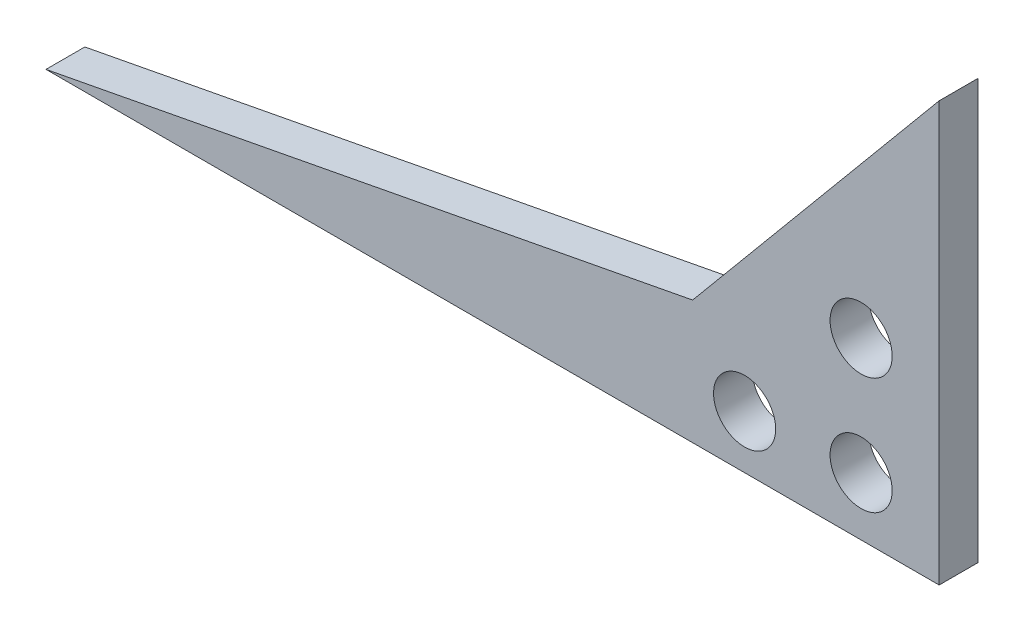
ISO-10303-21;
HEADER;
FILE_DESCRIPTION(('STEP AP214'),'2;1');
FILE_NAME('part.step','',(''),(''),'','','');
FILE_SCHEMA(('AUTOMOTIVE_DESIGN { 1 0 10303 214 1 1 1 1 }'));
ENDSEC;
DATA;
#1=APPLICATION_CONTEXT('core data for automotive mechanical design processes');
#2=APPLICATION_PROTOCOL_DEFINITION('international standard','automotive_design',2000,#1);
#3=PRODUCT_CONTEXT('',#1,'mechanical');
#4=PRODUCT('Part','Part','',(#3));
#5=PRODUCT_RELATED_PRODUCT_CATEGORY('part','',(#4));
#6=PRODUCT_DEFINITION_FORMATION('','',#4);
#7=PRODUCT_DEFINITION_CONTEXT('part definition',#1,'design');
#8=PRODUCT_DEFINITION('design','',#6,#7);
#9=PRODUCT_DEFINITION_SHAPE('','',#8);
#10=(LENGTH_UNIT() NAMED_UNIT(*) SI_UNIT(.MILLI.,.METRE.));
#11=(NAMED_UNIT(*) PLANE_ANGLE_UNIT() SI_UNIT($,.RADIAN.));
#12=(NAMED_UNIT(*) SI_UNIT($,.STERADIAN.) SOLID_ANGLE_UNIT());
#13=UNCERTAINTY_MEASURE_WITH_UNIT(LENGTH_MEASURE(1.E-05),#10,'distance_accuracy_value','');
#14=(GEOMETRIC_REPRESENTATION_CONTEXT(3) GLOBAL_UNCERTAINTY_ASSIGNED_CONTEXT((#13)) GLOBAL_UNIT_ASSIGNED_CONTEXT((#10,
#11,#12)) REPRESENTATION_CONTEXT('',''));
#15=CARTESIAN_POINT('',(0.,0.,0.));
#16=DIRECTION('',(0.,0.,1.));
#17=DIRECTION('',(1.,0.,0.));
#18=AXIS2_PLACEMENT_3D('',#15,#16,#17);
#19=CARTESIAN_POINT('',(-59.112279179189,4.93841001941218,5.));
#20=DIRECTION('',(0.768221279510949,-0.640184399768192,0.));
#21=DIRECTION('',(0.640184399768192,0.768221279510949,0.));
#22=AXIS2_PLACEMENT_3D('',#19,#20,#21);
#23=PLANE('',#22);
#24=DIRECTION('',(-0.640184399768192,-0.768221279510949,0.));
#25=VECTOR('',#24,1.);
#26=CARTESIAN_POINT('',(-59.112279179189,4.93841001941218,0.));
#27=LINE('',#26,#25);
#28=CARTESIAN_POINT('',(-27.3694119104477,43.0298507314453,0.));
#29=VERTEX_POINT('',#28);
#30=CARTESIAN_POINT('',(-59.112279179189,4.93841001941218,0.));
#31=VERTEX_POINT('',#30);
#32=EDGE_CURVE('E99',#29,#31,#27,.T.);
#33=ORIENTED_EDGE('',*,*,#32,.T.);
#34=DIRECTION('',(0.,0.,-1.));
#35=VECTOR('',#34,1.);
#36=CARTESIAN_POINT('',(-59.112279179189,4.93841001941218,5.));
#37=LINE('',#36,#35);
#38=CARTESIAN_POINT('',(-59.112279179189,4.93841001941218,5.));
#39=VERTEX_POINT('',#38);
#40=EDGE_CURVE('E11',#39,#31,#37,.T.);
#41=ORIENTED_EDGE('',*,*,#40,.F.);
#42=DIRECTION('',(-0.640184399768192,-0.768221279510949,0.));
#43=VECTOR('',#42,1.);
#44=CARTESIAN_POINT('',(-59.112279179189,4.93841001941218,5.));
#45=LINE('',#44,#43);
#46=CARTESIAN_POINT('',(-27.3694119104477,43.0298507314453,5.));
#47=VERTEX_POINT('',#46);
#48=EDGE_CURVE('E86',#47,#39,#45,.T.);
#49=ORIENTED_EDGE('',*,*,#48,.F.);
#50=DIRECTION('',(0.,0.,-1.));
#51=VECTOR('',#50,1.);
#52=CARTESIAN_POINT('',(-27.3694119104477,43.0298507314453,5.));
#53=LINE('',#52,#51);
#54=EDGE_CURVE('E95',#47,#29,#53,.T.);
#55=ORIENTED_EDGE('',*,*,#54,.T.);
#56=EDGE_LOOP('',(#33,#41,#49,#55));
#57=FACE_BOUND('',#56,.T.);
#58=ADVANCED_FACE('F36',(#57),#23,.F.);
#59=CARTESIAN_POINT('',(-142.369411910448,-10.9701492537314,5.));
#60=DIRECTION('',(0.187681959573898,-0.98222985194429,0.));
#61=DIRECTION('',(0.98222985194429,0.187681959573898,0.));
#62=AXIS2_PLACEMENT_3D('',#59,#60,#61);
#63=PLANE('',#62);
#64=DIRECTION('',(-0.98222985194429,-0.187681959573898,0.));
#65=VECTOR('',#64,1.);
#66=CARTESIAN_POINT('',(-142.369411910448,-10.9701492537314,0.));
#67=LINE('',#66,#65);
#68=CARTESIAN_POINT('',(-142.369411910448,-10.9701492537314,0.));
#69=VERTEX_POINT('',#68);
#70=EDGE_CURVE('E91',#31,#69,#67,.T.);
#71=ORIENTED_EDGE('',*,*,#70,.T.);
#72=DIRECTION('',(0.,0.,-1.));
#73=VECTOR('',#72,1.);
#74=CARTESIAN_POINT('',(-142.369411910448,-10.9701492537314,5.));
#75=LINE('',#74,#73);
#76=CARTESIAN_POINT('',(-142.369411910448,-10.9701492537314,5.));
#77=VERTEX_POINT('',#76);
#78=EDGE_CURVE('E44',#77,#69,#75,.T.);
#79=ORIENTED_EDGE('',*,*,#78,.F.);
#80=DIRECTION('',(-0.98222985194429,-0.187681959573898,0.));
#81=VECTOR('',#80,1.);
#82=CARTESIAN_POINT('',(-142.369411910448,-10.9701492537314,5.));
#83=LINE('',#82,#81);
#84=EDGE_CURVE('E81',#39,#77,#83,.T.);
#85=ORIENTED_EDGE('',*,*,#84,.F.);
#86=ORIENTED_EDGE('',*,*,#40,.T.);
#87=EDGE_LOOP('',(#71,#79,#85,#86));
#88=FACE_BOUND('',#87,.T.);
#89=ADVANCED_FACE('F90',(#88),#63,.F.);
#90=CARTESIAN_POINT('',(-72.3694119104477,-10.9701492537313,5.));
#91=DIRECTION('',(0.,1.,0.));
#92=DIRECTION('',(0.,0.,1.));
#93=AXIS2_PLACEMENT_3D('',#90,#91,#92);
#94=PLANE('',#93);
#95=DIRECTION('',(1.,0.,0.));
#96=VECTOR('',#95,1.);
#97=CARTESIAN_POINT('',(-72.3694119104477,-10.9701492537313,0.));
#98=LINE('',#97,#96);
#99=CARTESIAN_POINT('',(-27.3694119104477,-10.9701492537313,0.));
#100=VERTEX_POINT('',#99);
#101=EDGE_CURVE('E68',#69,#100,#98,.T.);
#102=ORIENTED_EDGE('',*,*,#101,.T.);
#103=DIRECTION('',(0.,0.,-1.));
#104=VECTOR('',#103,1.);
#105=CARTESIAN_POINT('',(-27.3694119104477,-10.9701492537313,5.));
#106=LINE('',#105,#104);
#107=CARTESIAN_POINT('',(-27.3694119104477,-10.9701492537313,5.));
#108=VERTEX_POINT('',#107);
#109=EDGE_CURVE('E92',#108,#100,#106,.T.);
#110=ORIENTED_EDGE('',*,*,#109,.F.);
#111=DIRECTION('',(1.,0.,0.));
#112=VECTOR('',#111,1.);
#113=CARTESIAN_POINT('',(-72.3694119104477,-10.9701492537313,5.));
#114=LINE('',#113,#112);
#115=EDGE_CURVE('E84',#77,#108,#114,.T.);
#116=ORIENTED_EDGE('',*,*,#115,.F.);
#117=ORIENTED_EDGE('',*,*,#78,.T.);
#118=EDGE_LOOP('',(#102,#110,#116,#117));
#119=FACE_BOUND('',#118,.T.);
#120=ADVANCED_FACE('F93',(#119),#94,.F.);
#121=CARTESIAN_POINT('',(-27.3694119104477,43.0298507314453,5.));
#122=DIRECTION('',(-1.,0.,0.));
#123=DIRECTION('',(0.,-1.,0.));
#124=AXIS2_PLACEMENT_3D('',#121,#122,#123);
#125=PLANE('',#124);
#126=DIRECTION('',(0.,1.,0.));
#127=VECTOR('',#126,1.);
#128=CARTESIAN_POINT('',(-27.3694119104477,43.0298507314453,0.));
#129=LINE('',#128,#127);
#130=EDGE_CURVE('E74',#100,#29,#129,.T.);
#131=ORIENTED_EDGE('',*,*,#130,.T.);
#132=ORIENTED_EDGE('',*,*,#54,.F.);
#133=DIRECTION('',(0.,1.,0.));
#134=VECTOR('',#133,1.);
#135=CARTESIAN_POINT('',(-27.3694119104477,43.0298507314453,5.));
#136=LINE('',#135,#134);
#137=EDGE_CURVE('E52',#108,#47,#136,.T.);
#138=ORIENTED_EDGE('',*,*,#137,.F.);
#139=ORIENTED_EDGE('',*,*,#109,.T.);
#140=EDGE_LOOP('',(#131,#132,#138,#139));
#141=FACE_BOUND('',#140,.T.);
#142=ADVANCED_FACE('F107',(#141),#125,.F.);
#143=CARTESIAN_POINT('',(0.,0.,5.));
#144=DIRECTION('',(0.,0.,-1.));
#145=DIRECTION('',(-1.,0.,0.));
#146=AXIS2_PLACEMENT_3D('',#143,#144,#145);
#147=PLANE('',#146);
#148=CARTESIAN_POINT('',(-37.4194389667426,11.5298507462686,5.));
#149=DIRECTION('',(0.,0.,1.));
#150=DIRECTION('',(1.,0.,0.));
#151=AXIS2_PLACEMENT_3D('',#148,#149,#150);
#152=CIRCLE('',#151,4.00000000000001);
#153=CARTESIAN_POINT('',(-33.4194389667426,11.5298507462686,5.));
#154=VERTEX_POINT('',#153);
#155=EDGE_CURVE('E119',#154,#154,#152,.T.);
#156=ORIENTED_EDGE('',*,*,#155,.F.);
#157=EDGE_LOOP('',(#156));
#158=FACE_BOUND('',#157,.T.);
#159=CARTESIAN_POINT('',(-52.4194389667426,-4.10566870594664,5.));
#160=DIRECTION('',(0.,0.,1.));
#161=DIRECTION('',(1.,0.,0.));
#162=AXIS2_PLACEMENT_3D('',#159,#160,#161);
#163=CIRCLE('',#162,4.00000000000001);
#164=CARTESIAN_POINT('',(-48.4194389667426,-4.10566870594664,5.));
#165=VERTEX_POINT('',#164);
#166=EDGE_CURVE('E118',#165,#165,#163,.T.);
#167=ORIENTED_EDGE('',*,*,#166,.F.);
#168=EDGE_LOOP('',(#167));
#169=FACE_BOUND('',#168,.T.);
#170=CARTESIAN_POINT('',(-37.4194389667426,-3.47014925373135,5.));
#171=DIRECTION('',(0.,0.,1.));
#172=DIRECTION('',(1.,0.,0.));
#173=AXIS2_PLACEMENT_3D('',#170,#171,#172);
#174=CIRCLE('',#173,4.00000000000001);
#175=CARTESIAN_POINT('',(-33.4194389667426,-3.47014925373135,5.));
#176=VERTEX_POINT('',#175);
#177=EDGE_CURVE('E115',#176,#176,#174,.T.);
#178=ORIENTED_EDGE('',*,*,#177,.F.);
#179=EDGE_LOOP('',(#178));
#180=FACE_BOUND('',#179,.T.);
#181=ORIENTED_EDGE('',*,*,#48,.T.);
#182=ORIENTED_EDGE('',*,*,#84,.T.);
#183=ORIENTED_EDGE('',*,*,#115,.T.);
#184=ORIENTED_EDGE('',*,*,#137,.T.);
#185=EDGE_LOOP('',(#181,#182,#183,#184));
#186=FACE_BOUND('',#185,.T.);
#187=ADVANCED_FACE('F82',(#158,#169,#180,#186),#147,.F.);
#188=CARTESIAN_POINT('',(0.,0.,0.));
#189=DIRECTION('',(0.,0.,-1.));
#190=DIRECTION('',(-1.,0.,0.));
#191=AXIS2_PLACEMENT_3D('',#188,#189,#190);
#192=PLANE('',#191);
#193=CARTESIAN_POINT('',(-37.4194389667426,11.5298507462686,0.));
#194=DIRECTION('',(0.,0.,-1.));
#195=DIRECTION('',(-1.,0.,0.));
#196=AXIS2_PLACEMENT_3D('',#193,#194,#195);
#197=CIRCLE('',#196,4.00000000000001);
#198=CARTESIAN_POINT('',(-41.4194389667426,11.5298507462686,0.));
#199=VERTEX_POINT('',#198);
#200=EDGE_CURVE('E123',#199,#199,#197,.F.);
#201=ORIENTED_EDGE('',*,*,#200,.T.);
#202=EDGE_LOOP('',(#201));
#203=FACE_BOUND('',#202,.T.);
#204=CARTESIAN_POINT('',(-52.4194389667426,-4.10566870594664,0.));
#205=DIRECTION('',(0.,0.,-1.));
#206=DIRECTION('',(-1.,0.,0.));
#207=AXIS2_PLACEMENT_3D('',#204,#205,#206);
#208=CIRCLE('',#207,4.00000000000001);
#209=CARTESIAN_POINT('',(-56.4194389667426,-4.10566870594664,0.));
#210=VERTEX_POINT('',#209);
#211=EDGE_CURVE('E122',#210,#210,#208,.F.);
#212=ORIENTED_EDGE('',*,*,#211,.T.);
#213=EDGE_LOOP('',(#212));
#214=FACE_BOUND('',#213,.T.);
#215=CARTESIAN_POINT('',(-37.4194389667426,-3.47014925373135,0.));
#216=DIRECTION('',(0.,0.,-1.));
#217=DIRECTION('',(-1.,0.,0.));
#218=AXIS2_PLACEMENT_3D('',#215,#216,#217);
#219=CIRCLE('',#218,4.00000000000001);
#220=CARTESIAN_POINT('',(-41.4194389667426,-3.47014925373135,0.));
#221=VERTEX_POINT('',#220);
#222=EDGE_CURVE('E102',#221,#221,#219,.F.);
#223=ORIENTED_EDGE('',*,*,#222,.T.);
#224=EDGE_LOOP('',(#223));
#225=FACE_BOUND('',#224,.T.);
#226=ORIENTED_EDGE('',*,*,#32,.F.);
#227=ORIENTED_EDGE('',*,*,#130,.F.);
#228=ORIENTED_EDGE('',*,*,#101,.F.);
#229=ORIENTED_EDGE('',*,*,#70,.F.);
#230=EDGE_LOOP('',(#226,#227,#228,#229));
#231=FACE_BOUND('',#230,.T.);
#232=ADVANCED_FACE('F110',(#203,#214,#225,#231),#192,.T.);
#233=CARTESIAN_POINT('',(-37.4194389667426,-3.47014925373135,-11.3137084989848));
#234=DIRECTION('',(0.,0.,1.));
#235=DIRECTION('',(1.,0.,0.));
#236=AXIS2_PLACEMENT_3D('',#233,#234,#235);
#237=CYLINDRICAL_SURFACE('',#236,4.00000000000001);
#238=ORIENTED_EDGE('',*,*,#177,.T.);
#239=EDGE_LOOP('',(#238));
#240=FACE_BOUND('',#239,.T.);
#241=ORIENTED_EDGE('',*,*,#222,.F.);
#242=EDGE_LOOP('',(#241));
#243=FACE_BOUND('',#242,.T.);
#244=ADVANCED_FACE('F136',(#240,#243),#237,.F.);
#245=CARTESIAN_POINT('',(-52.4194389667426,-4.10566870594664,-11.3137084989848));
#246=DIRECTION('',(0.,0.,1.));
#247=DIRECTION('',(1.,0.,0.));
#248=AXIS2_PLACEMENT_3D('',#245,#246,#247);
#249=CYLINDRICAL_SURFACE('',#248,4.00000000000001);
#250=ORIENTED_EDGE('',*,*,#166,.T.);
#251=EDGE_LOOP('',(#250));
#252=FACE_BOUND('',#251,.T.);
#253=ORIENTED_EDGE('',*,*,#211,.F.);
#254=EDGE_LOOP('',(#253));
#255=FACE_BOUND('',#254,.T.);
#256=ADVANCED_FACE('F133',(#252,#255),#249,.F.);
#257=CARTESIAN_POINT('',(-37.4194389667426,11.5298507462686,-11.3137084989848));
#258=DIRECTION('',(0.,0.,1.));
#259=DIRECTION('',(1.,0.,0.));
#260=AXIS2_PLACEMENT_3D('',#257,#258,#259);
#261=CYLINDRICAL_SURFACE('',#260,4.00000000000001);
#262=ORIENTED_EDGE('',*,*,#155,.T.);
#263=EDGE_LOOP('',(#262));
#264=FACE_BOUND('',#263,.T.);
#265=ORIENTED_EDGE('',*,*,#200,.F.);
#266=EDGE_LOOP('',(#265));
#267=FACE_BOUND('',#266,.T.);
#268=ADVANCED_FACE('F135',(#264,#267),#261,.F.);
#269=CLOSED_SHELL('',(#58,#89,#120,#142,#187,#232,#244,#256,#268));
#270=MANIFOLD_SOLID_BREP('B2',#269);
#271=ADVANCED_BREP_SHAPE_REPRESENTATION('',(#18,#270),#14);
#272=SHAPE_DEFINITION_REPRESENTATION(#9,#271);
ENDSEC;
END-ISO-10303-21;
